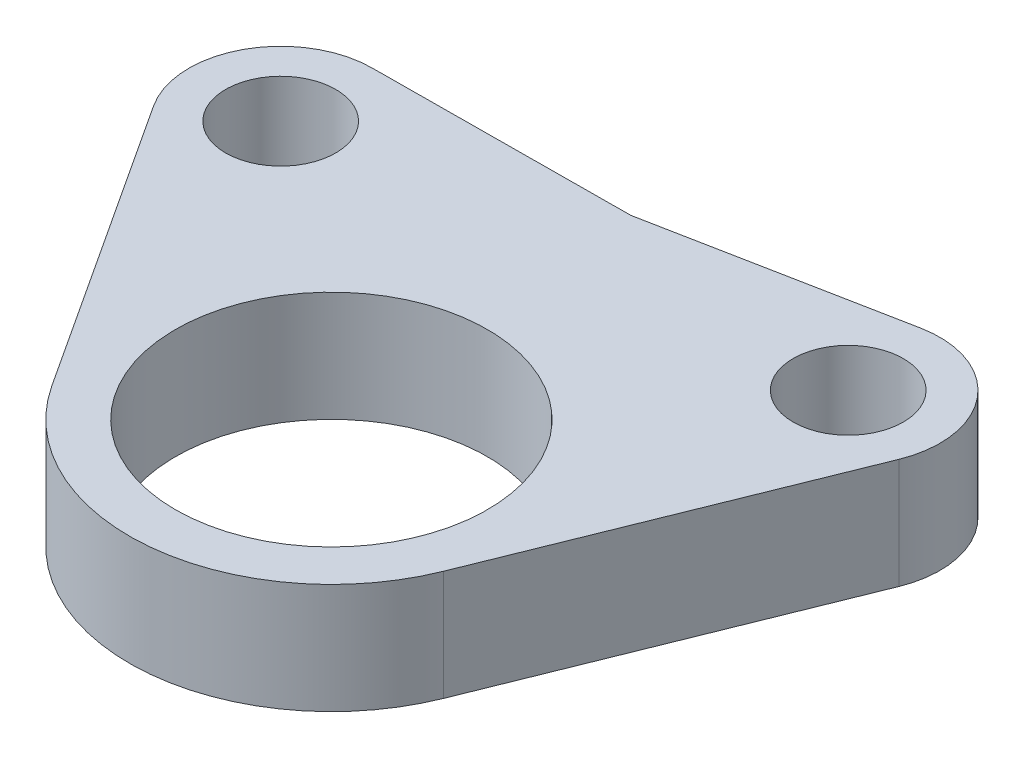
ISO-10303-21;
HEADER;
FILE_DESCRIPTION(('STEP AP214'),'2;1');
FILE_NAME('part.step','',(''),(''),'','','');
FILE_SCHEMA(('AUTOMOTIVE_DESIGN { 1 0 10303 214 1 1 1 1 }'));
ENDSEC;
DATA;
#1=APPLICATION_CONTEXT('core data for automotive mechanical design processes');
#2=APPLICATION_PROTOCOL_DEFINITION('international standard','automotive_design',2000,#1);
#3=PRODUCT_CONTEXT('',#1,'mechanical');
#4=PRODUCT('Part','Part','',(#3));
#5=PRODUCT_RELATED_PRODUCT_CATEGORY('part','',(#4));
#6=PRODUCT_DEFINITION_FORMATION('','',#4);
#7=PRODUCT_DEFINITION_CONTEXT('part definition',#1,'design');
#8=PRODUCT_DEFINITION('design','',#6,#7);
#9=PRODUCT_DEFINITION_SHAPE('','',#8);
#10=(LENGTH_UNIT() NAMED_UNIT(*) SI_UNIT(.MILLI.,.METRE.));
#11=(NAMED_UNIT(*) PLANE_ANGLE_UNIT() SI_UNIT($,.RADIAN.));
#12=(NAMED_UNIT(*) SI_UNIT($,.STERADIAN.) SOLID_ANGLE_UNIT());
#13=UNCERTAINTY_MEASURE_WITH_UNIT(LENGTH_MEASURE(1.E-05),#10,'distance_accuracy_value','');
#14=(GEOMETRIC_REPRESENTATION_CONTEXT(3) GLOBAL_UNCERTAINTY_ASSIGNED_CONTEXT((#13)) GLOBAL_UNIT_ASSIGNED_CONTEXT((#10,
#11,#12)) REPRESENTATION_CONTEXT('',''));
#15=CARTESIAN_POINT('',(0.,0.,0.));
#16=DIRECTION('',(0.,0.,1.));
#17=DIRECTION('',(1.,0.,0.));
#18=AXIS2_PLACEMENT_3D('',#15,#16,#17);
#19=CARTESIAN_POINT('',(0.,6.,0.));
#20=DIRECTION('',(0.,1.,0.));
#21=DIRECTION('',(0.,0.,1.));
#22=AXIS2_PLACEMENT_3D('',#19,#20,#21);
#23=PLANE('',#22);
#24=CARTESIAN_POINT('',(12.6937141570515,6.,-15.4554074970241));
#25=DIRECTION('',(0.,1.,0.));
#26=DIRECTION('',(0.,0.,1.));
#27=AXIS2_PLACEMENT_3D('',#24,#25,#26);
#28=CIRCLE('',#27,3.);
#29=CARTESIAN_POINT('',(12.6937141570515,6.,-12.4554074970241));
#30=VERTEX_POINT('',#29);
#31=EDGE_CURVE('E165',#30,#30,#28,.T.);
#32=ORIENTED_EDGE('',*,*,#31,.F.);
#33=EDGE_LOOP('',(#32));
#34=FACE_BOUND('',#33,.T.);
#35=CARTESIAN_POINT('',(0.,6.,0.));
#36=DIRECTION('',(0.,1.,0.));
#37=DIRECTION('',(0.,0.,1.));
#38=AXIS2_PLACEMENT_3D('',#35,#36,#37);
#39=CIRCLE('',#38,11.);
#40=CARTESIAN_POINT('',(-9.21010958730499,6.,6.01447266099305));
#41=VERTEX_POINT('',#40);
#42=CARTESIAN_POINT('',(10.2033983328201,6.,4.10982511328699));
#43=VERTEX_POINT('',#42);
#44=EDGE_CURVE('E138',#41,#43,#39,.T.);
#45=ORIENTED_EDGE('',*,*,#44,.T.);
#46=DIRECTION('',(0.373620464844272,0.,-0.927581666620007));
#47=VECTOR('',#46,1.);
#48=CARTESIAN_POINT('',(17.3316224901515,6.,-13.5873051728028));
#49=LINE('',#48,#47);
#50=CARTESIAN_POINT('',(17.3316224901515,6.,-13.5873051728028));
#51=VERTEX_POINT('',#50);
#52=EDGE_CURVE('E91',#43,#51,#49,.T.);
#53=ORIENTED_EDGE('',*,*,#52,.T.);
#54=CARTESIAN_POINT('',(12.6937141570515,6.,-15.4554074970241));
#55=DIRECTION('',(0.,1.,0.));
#56=DIRECTION('',(0.,0.,1.));
#57=AXIS2_PLACEMENT_3D('',#54,#55,#56);
#58=CIRCLE('',#57,4.99999999999999);
#59=CARTESIAN_POINT('',(11.7370983062552,6.,-20.3630429881752));
#60=VERTEX_POINT('',#59);
#61=EDGE_CURVE('E150',#51,#60,#58,.T.);
#62=ORIENTED_EDGE('',*,*,#61,.T.);
#63=DIRECTION('',(-0.981527098230205,0.,0.191323170159271));
#64=VECTOR('',#63,1.);
#65=CARTESIAN_POINT('',(-1.47194287061587,6.,-17.7882840871931));
#66=LINE('',#65,#64);
#67=CARTESIAN_POINT('',(-1.47194287061587,6.,-17.7882840871931));
#68=VERTEX_POINT('',#67);
#69=EDGE_CURVE('E107',#60,#68,#66,.T.);
#70=ORIENTED_EDGE('',*,*,#69,.T.);
#71=DIRECTION('',(-0.99997718694747,0.,0.00675467131884733));
#72=VECTOR('',#71,1.);
#73=CARTESIAN_POINT('',(-15.4891808536183,6.,-17.6936000917889));
#74=LINE('',#73,#72);
#75=CARTESIAN_POINT('',(-15.4891808536183,6.,-17.6936000917889));
#76=VERTEX_POINT('',#75);
#77=EDGE_CURVE('E101',#68,#76,#74,.T.);
#78=ORIENTED_EDGE('',*,*,#77,.T.);
#79=CARTESIAN_POINT('',(-15.4554074970241,6.,-12.6937141570516));
#80=DIRECTION('',(0.,1.,0.));
#81=DIRECTION('',(0.,0.,1.));
#82=AXIS2_PLACEMENT_3D('',#79,#80,#81);
#83=CIRCLE('',#82,5.);
#84=CARTESIAN_POINT('',(-19.6418209457991,6.,-9.95986294750927));
#85=VERTEX_POINT('',#84);
#86=EDGE_CURVE('E105',#76,#85,#83,.T.);
#87=ORIENTED_EDGE('',*,*,#86,.T.);
#88=DIRECTION('',(0.546770241908459,0.,0.837282689754999));
#89=VECTOR('',#88,1.);
#90=CARTESIAN_POINT('',(-9.21010958730499,6.,6.01447266099305));
#91=LINE('',#90,#89);
#92=EDGE_CURVE('E51',#85,#41,#91,.T.);
#93=ORIENTED_EDGE('',*,*,#92,.T.);
#94=EDGE_LOOP('',(#45,#53,#62,#70,#78,#87,#93));
#95=FACE_BOUND('',#94,.T.);
#96=CARTESIAN_POINT('',(0.,6.,0.));
#97=DIRECTION('',(0.,1.,0.));
#98=DIRECTION('',(0.,0.,1.));
#99=AXIS2_PLACEMENT_3D('',#96,#97,#98);
#100=CIRCLE('',#99,8.5);
#101=CARTESIAN_POINT('',(0.,6.,8.5));
#102=VERTEX_POINT('',#101);
#103=EDGE_CURVE('E129',#102,#102,#100,.T.);
#104=ORIENTED_EDGE('',*,*,#103,.F.);
#105=EDGE_LOOP('',(#104));
#106=FACE_BOUND('',#105,.T.);
#107=CARTESIAN_POINT('',(-15.4554074970241,6.,-12.6937141570516));
#108=DIRECTION('',(0.,1.,0.));
#109=DIRECTION('',(0.,0.,1.));
#110=AXIS2_PLACEMENT_3D('',#107,#108,#109);
#111=CIRCLE('',#110,3.);
#112=CARTESIAN_POINT('',(-15.4554074970241,6.,-9.69371415705156));
#113=VERTEX_POINT('',#112);
#114=EDGE_CURVE('E171',#113,#113,#111,.T.);
#115=ORIENTED_EDGE('',*,*,#114,.F.);
#116=EDGE_LOOP('',(#115));
#117=FACE_BOUND('',#116,.T.);
#118=ADVANCED_FACE('F34',(#34,#95,#106,#117),#23,.T.);
#119=CARTESIAN_POINT('',(0.,0.,0.));
#120=DIRECTION('',(0.,1.,0.));
#121=DIRECTION('',(0.,0.,1.));
#122=AXIS2_PLACEMENT_3D('',#119,#120,#121);
#123=PLANE('',#122);
#124=CARTESIAN_POINT('',(0.,0.,0.));
#125=DIRECTION('',(0.,1.,0.));
#126=DIRECTION('',(0.,0.,1.));
#127=AXIS2_PLACEMENT_3D('',#124,#125,#126);
#128=CIRCLE('',#127,11.);
#129=CARTESIAN_POINT('',(-9.21010958730499,0.,6.01447266099305));
#130=VERTEX_POINT('',#129);
#131=CARTESIAN_POINT('',(10.2033983328201,0.,4.10982511328699));
#132=VERTEX_POINT('',#131);
#133=EDGE_CURVE('E125',#130,#132,#128,.T.);
#134=ORIENTED_EDGE('',*,*,#133,.F.);
#135=DIRECTION('',(0.546770241908459,0.,0.837282689754999));
#136=VECTOR('',#135,1.);
#137=CARTESIAN_POINT('',(-9.21010958730499,0.,6.01447266099305));
#138=LINE('',#137,#136);
#139=CARTESIAN_POINT('',(-19.6418209457991,0.,-9.95986294750927));
#140=VERTEX_POINT('',#139);
#141=EDGE_CURVE('E83',#140,#130,#138,.T.);
#142=ORIENTED_EDGE('',*,*,#141,.F.);
#143=CARTESIAN_POINT('',(-15.4554074970241,0.,-12.6937141570516));
#144=DIRECTION('',(0.,1.,0.));
#145=DIRECTION('',(0.,0.,1.));
#146=AXIS2_PLACEMENT_3D('',#143,#144,#145);
#147=CIRCLE('',#146,5.);
#148=CARTESIAN_POINT('',(-15.4891808536183,0.,-17.6936000917889));
#149=VERTEX_POINT('',#148);
#150=EDGE_CURVE('E77',#149,#140,#147,.T.);
#151=ORIENTED_EDGE('',*,*,#150,.F.);
#152=DIRECTION('',(-0.99997718694747,0.,0.00675467131884733));
#153=VECTOR('',#152,1.);
#154=CARTESIAN_POINT('',(-15.4891808536183,0.,-17.6936000917889));
#155=LINE('',#154,#153);
#156=CARTESIAN_POINT('',(-1.47194287061587,0.,-17.7882840871931));
#157=VERTEX_POINT('',#156);
#158=EDGE_CURVE('E115',#157,#149,#155,.T.);
#159=ORIENTED_EDGE('',*,*,#158,.F.);
#160=DIRECTION('',(-0.981527098230205,0.,0.191323170159271));
#161=VECTOR('',#160,1.);
#162=CARTESIAN_POINT('',(-1.47194287061587,0.,-17.7882840871931));
#163=LINE('',#162,#161);
#164=CARTESIAN_POINT('',(11.7370983062552,0.,-20.3630429881752));
#165=VERTEX_POINT('',#164);
#166=EDGE_CURVE('E133',#165,#157,#163,.T.);
#167=ORIENTED_EDGE('',*,*,#166,.F.);
#168=CARTESIAN_POINT('',(12.6937141570515,0.,-15.4554074970241));
#169=DIRECTION('',(0.,1.,0.));
#170=DIRECTION('',(0.,0.,1.));
#171=AXIS2_PLACEMENT_3D('',#168,#169,#170);
#172=CIRCLE('',#171,4.99999999999999);
#173=CARTESIAN_POINT('',(17.3316224901515,0.,-13.5873051728028));
#174=VERTEX_POINT('',#173);
#175=EDGE_CURVE('E131',#174,#165,#172,.T.);
#176=ORIENTED_EDGE('',*,*,#175,.F.);
#177=DIRECTION('',(0.373620464844272,0.,-0.927581666620007));
#178=VECTOR('',#177,1.);
#179=CARTESIAN_POINT('',(17.3316224901515,0.,-13.5873051728028));
#180=LINE('',#179,#178);
#181=EDGE_CURVE('E128',#132,#174,#180,.T.);
#182=ORIENTED_EDGE('',*,*,#181,.F.);
#183=EDGE_LOOP('',(#134,#142,#151,#159,#167,#176,#182));
#184=FACE_BOUND('',#183,.T.);
#185=CARTESIAN_POINT('',(0.,0.,0.));
#186=DIRECTION('',(0.,1.,0.));
#187=DIRECTION('',(0.,0.,1.));
#188=AXIS2_PLACEMENT_3D('',#185,#186,#187);
#189=CIRCLE('',#188,8.5);
#190=CARTESIAN_POINT('',(0.,0.,8.5));
#191=VERTEX_POINT('',#190);
#192=EDGE_CURVE('E162',#191,#191,#189,.T.);
#193=ORIENTED_EDGE('',*,*,#192,.T.);
#194=EDGE_LOOP('',(#193));
#195=FACE_BOUND('',#194,.T.);
#196=CARTESIAN_POINT('',(12.6937141570515,0.,-15.4554074970241));
#197=DIRECTION('',(0.,1.,0.));
#198=DIRECTION('',(0.,0.,1.));
#199=AXIS2_PLACEMENT_3D('',#196,#197,#198);
#200=CIRCLE('',#199,3.);
#201=CARTESIAN_POINT('',(12.6937141570515,0.,-12.4554074970241));
#202=VERTEX_POINT('',#201);
#203=EDGE_CURVE('E168',#202,#202,#200,.T.);
#204=ORIENTED_EDGE('',*,*,#203,.T.);
#205=EDGE_LOOP('',(#204));
#206=FACE_BOUND('',#205,.T.);
#207=CARTESIAN_POINT('',(-15.4554074970241,0.,-12.6937141570516));
#208=DIRECTION('',(0.,1.,0.));
#209=DIRECTION('',(0.,0.,1.));
#210=AXIS2_PLACEMENT_3D('',#207,#208,#209);
#211=CIRCLE('',#210,3.);
#212=CARTESIAN_POINT('',(-15.4554074970241,0.,-9.69371415705156));
#213=VERTEX_POINT('',#212);
#214=EDGE_CURVE('E174',#213,#213,#211,.T.);
#215=ORIENTED_EDGE('',*,*,#214,.T.);
#216=EDGE_LOOP('',(#215));
#217=FACE_BOUND('',#216,.T.);
#218=ADVANCED_FACE('F154',(#184,#195,#206,#217),#123,.F.);
#219=CARTESIAN_POINT('',(0.,6.,0.));
#220=DIRECTION('',(0.,-1.,0.));
#221=DIRECTION('',(0.,0.,-1.));
#222=AXIS2_PLACEMENT_3D('',#219,#220,#221);
#223=CYLINDRICAL_SURFACE('',#222,11.);
#224=ORIENTED_EDGE('',*,*,#133,.T.);
#225=DIRECTION('',(0.,-1.,0.));
#226=VECTOR('',#225,1.);
#227=CARTESIAN_POINT('',(10.2033983328201,6.,4.10982511328699));
#228=LINE('',#227,#226);
#229=EDGE_CURVE('E11',#43,#132,#228,.T.);
#230=ORIENTED_EDGE('',*,*,#229,.F.);
#231=ORIENTED_EDGE('',*,*,#44,.F.);
#232=DIRECTION('',(0.,-1.,0.));
#233=VECTOR('',#232,1.);
#234=CARTESIAN_POINT('',(-9.21010958730499,6.,6.01447266099305));
#235=LINE('',#234,#233);
#236=EDGE_CURVE('E121',#41,#130,#235,.T.);
#237=ORIENTED_EDGE('',*,*,#236,.T.);
#238=EDGE_LOOP('',(#224,#230,#231,#237));
#239=FACE_BOUND('',#238,.T.);
#240=ADVANCED_FACE('F36',(#239),#223,.T.);
#241=CARTESIAN_POINT('',(17.3316224901515,6.,-13.5873051728028));
#242=DIRECTION('',(-0.927581666620007,0.,-0.373620464844272));
#243=DIRECTION('',(-0.373620464844272,0.,0.927581666620007));
#244=AXIS2_PLACEMENT_3D('',#241,#242,#243);
#245=PLANE('',#244);
#246=ORIENTED_EDGE('',*,*,#181,.T.);
#247=DIRECTION('',(0.,-1.,0.));
#248=VECTOR('',#247,1.);
#249=CARTESIAN_POINT('',(17.3316224901515,6.,-13.5873051728028));
#250=LINE('',#249,#248);
#251=EDGE_CURVE('E43',#51,#174,#250,.T.);
#252=ORIENTED_EDGE('',*,*,#251,.F.);
#253=ORIENTED_EDGE('',*,*,#52,.F.);
#254=ORIENTED_EDGE('',*,*,#229,.T.);
#255=EDGE_LOOP('',(#246,#252,#253,#254));
#256=FACE_BOUND('',#255,.T.);
#257=ADVANCED_FACE('F205',(#256),#245,.F.);
#258=CARTESIAN_POINT('',(12.6937141570515,6.,-15.4554074970241));
#259=DIRECTION('',(0.,-1.,0.));
#260=DIRECTION('',(0.,0.,-1.));
#261=AXIS2_PLACEMENT_3D('',#258,#259,#260);
#262=CYLINDRICAL_SURFACE('',#261,4.99999999999999);
#263=ORIENTED_EDGE('',*,*,#175,.T.);
#264=DIRECTION('',(0.,-1.,0.));
#265=VECTOR('',#264,1.);
#266=CARTESIAN_POINT('',(11.7370983062552,6.,-20.3630429881752));
#267=LINE('',#266,#265);
#268=EDGE_CURVE('E142',#60,#165,#267,.T.);
#269=ORIENTED_EDGE('',*,*,#268,.F.);
#270=ORIENTED_EDGE('',*,*,#61,.F.);
#271=ORIENTED_EDGE('',*,*,#251,.T.);
#272=EDGE_LOOP('',(#263,#269,#270,#271));
#273=FACE_BOUND('',#272,.T.);
#274=ADVANCED_FACE('F148',(#273),#262,.T.);
#275=CARTESIAN_POINT('',(-1.47194287061587,6.,-17.7882840871931));
#276=DIRECTION('',(0.191323170159271,0.,0.981527098230205));
#277=DIRECTION('',(0.981527098230205,0.,-0.191323170159271));
#278=AXIS2_PLACEMENT_3D('',#275,#276,#277);
#279=PLANE('',#278);
#280=ORIENTED_EDGE('',*,*,#166,.T.);
#281=DIRECTION('',(0.,-1.,0.));
#282=VECTOR('',#281,1.);
#283=CARTESIAN_POINT('',(-1.47194287061587,6.,-17.7882840871931));
#284=LINE('',#283,#282);
#285=EDGE_CURVE('E116',#68,#157,#284,.T.);
#286=ORIENTED_EDGE('',*,*,#285,.F.);
#287=ORIENTED_EDGE('',*,*,#69,.F.);
#288=ORIENTED_EDGE('',*,*,#268,.T.);
#289=EDGE_LOOP('',(#280,#286,#287,#288));
#290=FACE_BOUND('',#289,.T.);
#291=ADVANCED_FACE('F157',(#290),#279,.F.);
#292=CARTESIAN_POINT('',(-15.4891808536183,6.,-17.6936000917889));
#293=DIRECTION('',(0.00675467131884733,0.,0.999977186947469));
#294=DIRECTION('',(0.99997718694747,0.,-0.00675467131884734));
#295=AXIS2_PLACEMENT_3D('',#292,#293,#294);
#296=PLANE('',#295);
#297=ORIENTED_EDGE('',*,*,#158,.T.);
#298=DIRECTION('',(0.,-1.,0.));
#299=VECTOR('',#298,1.);
#300=CARTESIAN_POINT('',(-15.4891808536183,6.,-17.6936000917889));
#301=LINE('',#300,#299);
#302=EDGE_CURVE('E112',#76,#149,#301,.T.);
#303=ORIENTED_EDGE('',*,*,#302,.F.);
#304=ORIENTED_EDGE('',*,*,#77,.F.);
#305=ORIENTED_EDGE('',*,*,#285,.T.);
#306=EDGE_LOOP('',(#297,#303,#304,#305));
#307=FACE_BOUND('',#306,.T.);
#308=ADVANCED_FACE('F113',(#307),#296,.F.);
#309=CARTESIAN_POINT('',(-15.4554074970241,6.,-12.6937141570516));
#310=DIRECTION('',(0.,-1.,0.));
#311=DIRECTION('',(0.,0.,-1.));
#312=AXIS2_PLACEMENT_3D('',#309,#310,#311);
#313=CYLINDRICAL_SURFACE('',#312,5.);
#314=ORIENTED_EDGE('',*,*,#150,.T.);
#315=DIRECTION('',(0.,-1.,0.));
#316=VECTOR('',#315,1.);
#317=CARTESIAN_POINT('',(-19.6418209457991,6.,-9.95986294750927));
#318=LINE('',#317,#316);
#319=EDGE_CURVE('E117',#85,#140,#318,.T.);
#320=ORIENTED_EDGE('',*,*,#319,.F.);
#321=ORIENTED_EDGE('',*,*,#86,.F.);
#322=ORIENTED_EDGE('',*,*,#302,.T.);
#323=EDGE_LOOP('',(#314,#320,#321,#322));
#324=FACE_BOUND('',#323,.T.);
#325=ADVANCED_FACE('F119',(#324),#313,.T.);
#326=CARTESIAN_POINT('',(-9.21010958730499,6.,6.01447266099305));
#327=DIRECTION('',(0.837282689754999,0.,-0.546770241908459));
#328=DIRECTION('',(-0.546770241908459,0.,-0.837282689754999));
#329=AXIS2_PLACEMENT_3D('',#326,#327,#328);
#330=PLANE('',#329);
#331=ORIENTED_EDGE('',*,*,#141,.T.);
#332=ORIENTED_EDGE('',*,*,#236,.F.);
#333=ORIENTED_EDGE('',*,*,#92,.F.);
#334=ORIENTED_EDGE('',*,*,#319,.T.);
#335=EDGE_LOOP('',(#331,#332,#333,#334));
#336=FACE_BOUND('',#335,.T.);
#337=ADVANCED_FACE('F195',(#336),#330,.F.);
#338=CARTESIAN_POINT('',(0.,6.,0.));
#339=DIRECTION('',(0.,-1.,0.));
#340=DIRECTION('',(0.,0.,-1.));
#341=AXIS2_PLACEMENT_3D('',#338,#339,#340);
#342=CYLINDRICAL_SURFACE('',#341,8.5);
#343=ORIENTED_EDGE('',*,*,#103,.T.);
#344=EDGE_LOOP('',(#343));
#345=FACE_BOUND('',#344,.T.);
#346=ORIENTED_EDGE('',*,*,#192,.F.);
#347=EDGE_LOOP('',(#346));
#348=FACE_BOUND('',#347,.T.);
#349=ADVANCED_FACE('F192',(#345,#348),#342,.F.);
#350=CARTESIAN_POINT('',(12.6937141570515,6.,-15.4554074970241));
#351=DIRECTION('',(0.,-1.,0.));
#352=DIRECTION('',(0.,0.,-1.));
#353=AXIS2_PLACEMENT_3D('',#350,#351,#352);
#354=CYLINDRICAL_SURFACE('',#353,3.);
#355=ORIENTED_EDGE('',*,*,#31,.T.);
#356=EDGE_LOOP('',(#355));
#357=FACE_BOUND('',#356,.T.);
#358=ORIENTED_EDGE('',*,*,#203,.F.);
#359=EDGE_LOOP('',(#358));
#360=FACE_BOUND('',#359,.T.);
#361=ADVANCED_FACE('F264',(#357,#360),#354,.F.);
#362=CARTESIAN_POINT('',(-15.4554074970241,6.,-12.6937141570516));
#363=DIRECTION('',(0.,-1.,0.));
#364=DIRECTION('',(0.,0.,-1.));
#365=AXIS2_PLACEMENT_3D('',#362,#363,#364);
#366=CYLINDRICAL_SURFACE('',#365,3.);
#367=ORIENTED_EDGE('',*,*,#114,.T.);
#368=EDGE_LOOP('',(#367));
#369=FACE_BOUND('',#368,.T.);
#370=ORIENTED_EDGE('',*,*,#214,.F.);
#371=EDGE_LOOP('',(#370));
#372=FACE_BOUND('',#371,.T.);
#373=ADVANCED_FACE('F180',(#369,#372),#366,.F.);
#374=CLOSED_SHELL('',(#118,#218,#240,#257,#274,#291,#308,#325,#337,#349,#361,#373));
#375=MANIFOLD_SOLID_BREP('B2',#374);
#376=ADVANCED_BREP_SHAPE_REPRESENTATION('',(#18,#375),#14);
#377=SHAPE_DEFINITION_REPRESENTATION(#9,#376);
ENDSEC;
END-ISO-10303-21;
